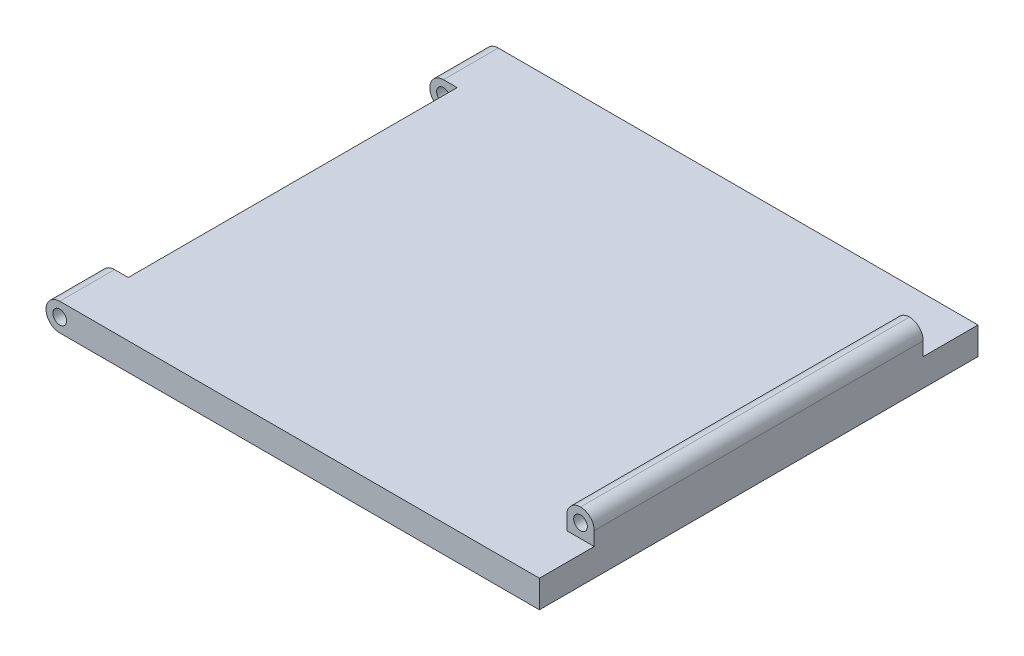
ISO-10303-21;
HEADER;
FILE_DESCRIPTION(('STEP AP214'),'2;1');
FILE_NAME('part.step','',(''),(''),'','','');
FILE_SCHEMA(('AUTOMOTIVE_DESIGN { 1 0 10303 214 1 1 1 1 }'));
ENDSEC;
DATA;
#1=APPLICATION_CONTEXT('core data for automotive mechanical design processes');
#2=APPLICATION_PROTOCOL_DEFINITION('international standard','automotive_design',2000,#1);
#3=PRODUCT_CONTEXT('',#1,'mechanical');
#4=PRODUCT('Part','Part','',(#3));
#5=PRODUCT_RELATED_PRODUCT_CATEGORY('part','',(#4));
#6=PRODUCT_DEFINITION_FORMATION('','',#4);
#7=PRODUCT_DEFINITION_CONTEXT('part definition',#1,'design');
#8=PRODUCT_DEFINITION('design','',#6,#7);
#9=PRODUCT_DEFINITION_SHAPE('','',#8);
#10=(LENGTH_UNIT() NAMED_UNIT(*) SI_UNIT(.MILLI.,.METRE.));
#11=(NAMED_UNIT(*) PLANE_ANGLE_UNIT() SI_UNIT($,.RADIAN.));
#12=(NAMED_UNIT(*) SI_UNIT($,.STERADIAN.) SOLID_ANGLE_UNIT());
#13=UNCERTAINTY_MEASURE_WITH_UNIT(LENGTH_MEASURE(1.E-05),#10,'distance_accuracy_value','');
#14=(GEOMETRIC_REPRESENTATION_CONTEXT(3) GLOBAL_UNCERTAINTY_ASSIGNED_CONTEXT((#13)) GLOBAL_UNIT_ASSIGNED_CONTEXT((#10,
#11,#12)) REPRESENTATION_CONTEXT('',''));
#15=CARTESIAN_POINT('',(0.,0.,0.));
#16=DIRECTION('',(0.,0.,1.));
#17=DIRECTION('',(1.,0.,0.));
#18=AXIS2_PLACEMENT_3D('',#15,#16,#17);
#19=CARTESIAN_POINT('',(85.,0.,40.));
#20=DIRECTION('',(-1.,0.,0.));
#21=DIRECTION('',(0.,0.,1.));
#22=AXIS2_PLACEMENT_3D('',#19,#20,#21);
#23=PLANE('',#22);
#24=DIRECTION('',(0.,1.,0.));
#25=VECTOR('',#24,1.);
#26=CARTESIAN_POINT('',(85.,10.,-30.));
#27=LINE('',#26,#25);
#28=CARTESIAN_POINT('',(85.,5.,-30.));
#29=VERTEX_POINT('',#28);
#30=CARTESIAN_POINT('',(85.,7.5,-30.));
#31=VERTEX_POINT('',#30);
#32=EDGE_CURVE('E240',#29,#31,#27,.T.);
#33=ORIENTED_EDGE('',*,*,#32,.T.);
#34=DIRECTION('',(0.,0.,-1.));
#35=VECTOR('',#34,1.);
#36=CARTESIAN_POINT('',(85.,7.5,40.));
#37=LINE('',#36,#35);
#38=CARTESIAN_POINT('',(85.,7.5,30.));
#39=VERTEX_POINT('',#38);
#40=EDGE_CURVE('E11',#31,#39,#37,.F.);
#41=ORIENTED_EDGE('',*,*,#40,.T.);
#42=DIRECTION('',(0.,1.,0.));
#43=VECTOR('',#42,1.);
#44=CARTESIAN_POINT('',(85.,10.,30.));
#45=LINE('',#44,#43);
#46=CARTESIAN_POINT('',(85.,5.,30.));
#47=VERTEX_POINT('',#46);
#48=EDGE_CURVE('E152',#47,#39,#45,.T.);
#49=ORIENTED_EDGE('',*,*,#48,.F.);
#50=DIRECTION('',(0.,0.,-1.));
#51=VECTOR('',#50,1.);
#52=CARTESIAN_POINT('',(85.,5.,40.));
#53=LINE('',#52,#51);
#54=CARTESIAN_POINT('',(85.,5.,40.));
#55=VERTEX_POINT('',#54);
#56=EDGE_CURVE('E139',#55,#47,#53,.T.);
#57=ORIENTED_EDGE('',*,*,#56,.F.);
#58=DIRECTION('',(0.,1.,0.));
#59=VECTOR('',#58,1.);
#60=CARTESIAN_POINT('',(85.,0.,40.));
#61=LINE('',#60,#59);
#62=CARTESIAN_POINT('',(85.,0.,40.));
#63=VERTEX_POINT('',#62);
#64=EDGE_CURVE('E148',#63,#55,#61,.T.);
#65=ORIENTED_EDGE('',*,*,#64,.F.);
#66=DIRECTION('',(0.,0.,-1.));
#67=VECTOR('',#66,1.);
#68=CARTESIAN_POINT('',(85.,0.,40.));
#69=LINE('',#68,#67);
#70=CARTESIAN_POINT('',(85.,0.,-40.));
#71=VERTEX_POINT('',#70);
#72=EDGE_CURVE('E182',#63,#71,#69,.T.);
#73=ORIENTED_EDGE('',*,*,#72,.T.);
#74=DIRECTION('',(0.,1.,0.));
#75=VECTOR('',#74,1.);
#76=CARTESIAN_POINT('',(85.,0.,-40.));
#77=LINE('',#76,#75);
#78=CARTESIAN_POINT('',(85.,5.,-40.));
#79=VERTEX_POINT('',#78);
#80=EDGE_CURVE('E170',#71,#79,#77,.T.);
#81=ORIENTED_EDGE('',*,*,#80,.T.);
#82=DIRECTION('',(0.,0.,1.));
#83=VECTOR('',#82,1.);
#84=CARTESIAN_POINT('',(85.,5.,-40.));
#85=LINE('',#84,#83);
#86=EDGE_CURVE('E243',#79,#29,#85,.T.);
#87=ORIENTED_EDGE('',*,*,#86,.T.);
#88=EDGE_LOOP('',(#33,#41,#49,#57,#65,#73,#81,#87));
#89=FACE_BOUND('',#88,.T.);
#90=ADVANCED_FACE('F38',(#89),#23,.F.);
#91=CARTESIAN_POINT('',(0.,0.,40.));
#92=DIRECTION('',(0.,0.,1.));
#93=DIRECTION('',(1.,0.,0.));
#94=AXIS2_PLACEMENT_3D('',#91,#92,#93);
#95=PLANE('',#94);
#96=CARTESIAN_POINT('',(-2.5,2.5,40.));
#97=DIRECTION('',(0.,0.,1.));
#98=DIRECTION('',(1.,0.,0.));
#99=AXIS2_PLACEMENT_3D('',#96,#97,#98);
#100=CIRCLE('',#99,1.25);
#101=CARTESIAN_POINT('',(-1.25,2.5,40.));
#102=VERTEX_POINT('',#101);
#103=EDGE_CURVE('E285',#102,#102,#100,.T.);
#104=ORIENTED_EDGE('',*,*,#103,.F.);
#105=EDGE_LOOP('',(#104));
#106=FACE_BOUND('',#105,.T.);
#107=ORIENTED_EDGE('',*,*,#64,.T.);
#108=DIRECTION('',(-1.,0.,0.));
#109=VECTOR('',#108,1.);
#110=CARTESIAN_POINT('',(80.,5.00000000000001,40.));
#111=LINE('',#110,#109);
#112=CARTESIAN_POINT('',(-2.5,5.,40.));
#113=VERTEX_POINT('',#112);
#114=EDGE_CURVE('E135',#55,#113,#111,.T.);
#115=ORIENTED_EDGE('',*,*,#114,.T.);
#116=CARTESIAN_POINT('',(-2.5,2.5,40.));
#117=DIRECTION('',(0.,0.,1.));
#118=DIRECTION('',(1.,0.,0.));
#119=AXIS2_PLACEMENT_3D('',#116,#117,#118);
#120=CIRCLE('',#119,2.5);
#121=CARTESIAN_POINT('',(-2.5,0.,40.));
#122=VERTEX_POINT('',#121);
#123=EDGE_CURVE('E302',#113,#122,#120,.T.);
#124=ORIENTED_EDGE('',*,*,#123,.T.);
#125=DIRECTION('',(1.,0.,0.));
#126=VECTOR('',#125,1.);
#127=CARTESIAN_POINT('',(0.,0.,40.));
#128=LINE('',#127,#126);
#129=EDGE_CURVE('E158',#122,#63,#128,.T.);
#130=ORIENTED_EDGE('',*,*,#129,.T.);
#131=EDGE_LOOP('',(#107,#115,#124,#130));
#132=FACE_BOUND('',#131,.T.);
#133=ADVANCED_FACE('F157',(#106,#132),#95,.T.);
#134=CARTESIAN_POINT('',(0.,5.,40.));
#135=DIRECTION('',(1.,0.,0.));
#136=DIRECTION('',(0.,1.,0.));
#137=AXIS2_PLACEMENT_3D('',#134,#135,#136);
#138=PLANE('',#137);
#139=DIRECTION('',(0.,1.,0.));
#140=VECTOR('',#139,1.);
#141=CARTESIAN_POINT('',(0.,0.,-30.));
#142=LINE('',#141,#140);
#143=CARTESIAN_POINT('',(0.,0.,-30.));
#144=VERTEX_POINT('',#143);
#145=CARTESIAN_POINT('',(0.,5.,-30.));
#146=VERTEX_POINT('',#145);
#147=EDGE_CURVE('E255',#144,#146,#142,.T.);
#148=ORIENTED_EDGE('',*,*,#147,.F.);
#149=DIRECTION('',(0.,0.,-1.));
#150=VECTOR('',#149,1.);
#151=CARTESIAN_POINT('',(0.,0.,40.));
#152=LINE('',#151,#150);
#153=CARTESIAN_POINT('',(0.,0.,30.));
#154=VERTEX_POINT('',#153);
#155=EDGE_CURVE('E185',#154,#144,#152,.T.);
#156=ORIENTED_EDGE('',*,*,#155,.F.);
#157=DIRECTION('',(0.,1.,0.));
#158=VECTOR('',#157,1.);
#159=CARTESIAN_POINT('',(0.,0.,30.));
#160=LINE('',#159,#158);
#161=CARTESIAN_POINT('',(0.,5.,30.));
#162=VERTEX_POINT('',#161);
#163=EDGE_CURVE('E289',#154,#162,#160,.T.);
#164=ORIENTED_EDGE('',*,*,#163,.T.);
#165=DIRECTION('',(0.,0.,-1.));
#166=VECTOR('',#165,1.);
#167=CARTESIAN_POINT('',(0.,5.,40.));
#168=LINE('',#167,#166);
#169=EDGE_CURVE('E147',#162,#146,#168,.T.);
#170=ORIENTED_EDGE('',*,*,#169,.T.);
#171=EDGE_LOOP('',(#148,#156,#164,#170));
#172=FACE_BOUND('',#171,.T.);
#173=ADVANCED_FACE('F339',(#172),#138,.F.);
#174=CARTESIAN_POINT('',(0.,0.,40.));
#175=DIRECTION('',(0.,1.,0.));
#176=DIRECTION('',(0.,0.,1.));
#177=AXIS2_PLACEMENT_3D('',#174,#175,#176);
#178=PLANE('',#177);
#179=DIRECTION('',(1.,0.,0.));
#180=VECTOR('',#179,1.);
#181=CARTESIAN_POINT('',(0.,0.,-40.));
#182=LINE('',#181,#180);
#183=CARTESIAN_POINT('',(-2.5,0.,-40.));
#184=VERTEX_POINT('',#183);
#185=EDGE_CURVE('E167',#184,#71,#182,.T.);
#186=ORIENTED_EDGE('',*,*,#185,.T.);
#187=ORIENTED_EDGE('',*,*,#72,.F.);
#188=ORIENTED_EDGE('',*,*,#129,.F.);
#189=DIRECTION('',(0.,0.,-1.));
#190=VECTOR('',#189,1.);
#191=CARTESIAN_POINT('',(-2.5,0.,40.));
#192=LINE('',#191,#190);
#193=CARTESIAN_POINT('',(-2.5,0.,30.));
#194=VERTEX_POINT('',#193);
#195=EDGE_CURVE('E305',#122,#194,#192,.T.);
#196=ORIENTED_EDGE('',*,*,#195,.T.);
#197=DIRECTION('',(1.,0.,0.));
#198=VECTOR('',#197,1.);
#199=CARTESIAN_POINT('',(-2.5,0.,30.));
#200=LINE('',#199,#198);
#201=EDGE_CURVE('E299',#194,#154,#200,.T.);
#202=ORIENTED_EDGE('',*,*,#201,.T.);
#203=ORIENTED_EDGE('',*,*,#155,.T.);
#204=DIRECTION('',(1.,0.,0.));
#205=VECTOR('',#204,1.);
#206=CARTESIAN_POINT('',(-2.5,0.,-30.));
#207=LINE('',#206,#205);
#208=CARTESIAN_POINT('',(-2.5,0.,-30.));
#209=VERTEX_POINT('',#208);
#210=EDGE_CURVE('E259',#209,#144,#207,.T.);
#211=ORIENTED_EDGE('',*,*,#210,.F.);
#212=DIRECTION('',(0.,0.,1.));
#213=VECTOR('',#212,1.);
#214=CARTESIAN_POINT('',(-2.5,0.,-40.));
#215=LINE('',#214,#213);
#216=EDGE_CURVE('E278',#184,#209,#215,.T.);
#217=ORIENTED_EDGE('',*,*,#216,.F.);
#218=EDGE_LOOP('',(#186,#187,#188,#196,#202,#203,#211,#217));
#219=FACE_BOUND('',#218,.T.);
#220=ADVANCED_FACE('F321',(#219),#178,.F.);
#221=CARTESIAN_POINT('',(80.,10.,40.));
#222=DIRECTION('',(1.,0.,0.));
#223=DIRECTION('',(0.,0.,-1.));
#224=AXIS2_PLACEMENT_3D('',#221,#222,#223);
#225=PLANE('',#224);
#226=DIRECTION('',(0.,-1.,0.));
#227=VECTOR('',#226,1.);
#228=CARTESIAN_POINT('',(80.,10.,30.));
#229=LINE('',#228,#227);
#230=CARTESIAN_POINT('',(80.,7.5,30.));
#231=VERTEX_POINT('',#230);
#232=CARTESIAN_POINT('',(80.,5.,30.));
#233=VERTEX_POINT('',#232);
#234=EDGE_CURVE('E210',#231,#233,#229,.T.);
#235=ORIENTED_EDGE('',*,*,#234,.F.);
#236=DIRECTION('',(0.,0.,-1.));
#237=VECTOR('',#236,1.);
#238=CARTESIAN_POINT('',(80.,7.5,40.));
#239=LINE('',#238,#237);
#240=CARTESIAN_POINT('',(80.,7.5,-30.));
#241=VERTEX_POINT('',#240);
#242=EDGE_CURVE('E189',#231,#241,#239,.T.);
#243=ORIENTED_EDGE('',*,*,#242,.T.);
#244=DIRECTION('',(0.,-1.,0.));
#245=VECTOR('',#244,1.);
#246=CARTESIAN_POINT('',(80.,10.,-30.));
#247=LINE('',#246,#245);
#248=CARTESIAN_POINT('',(80.,5.,-30.));
#249=VERTEX_POINT('',#248);
#250=EDGE_CURVE('E154',#241,#249,#247,.T.);
#251=ORIENTED_EDGE('',*,*,#250,.T.);
#252=DIRECTION('',(0.,0.,-1.));
#253=VECTOR('',#252,1.);
#254=CARTESIAN_POINT('',(80.,5.00000000000001,40.));
#255=LINE('',#254,#253);
#256=EDGE_CURVE('E178',#233,#249,#255,.T.);
#257=ORIENTED_EDGE('',*,*,#256,.F.);
#258=EDGE_LOOP('',(#235,#243,#251,#257));
#259=FACE_BOUND('',#258,.T.);
#260=ADVANCED_FACE('F216',(#259),#225,.F.);
#261=CARTESIAN_POINT('',(80.,5.00000000000001,40.));
#262=DIRECTION('',(0.,-1.,0.));
#263=DIRECTION('',(1.,0.,0.));
#264=AXIS2_PLACEMENT_3D('',#261,#262,#263);
#265=PLANE('',#264);
#266=DIRECTION('',(-1.,0.,0.));
#267=VECTOR('',#266,1.);
#268=CARTESIAN_POINT('',(80.,5.00000000000001,-40.));
#269=LINE('',#268,#267);
#270=CARTESIAN_POINT('',(-2.5,5.,-40.));
#271=VERTEX_POINT('',#270);
#272=EDGE_CURVE('E163',#79,#271,#269,.T.);
#273=ORIENTED_EDGE('',*,*,#272,.T.);
#274=DIRECTION('',(0.,0.,1.));
#275=VECTOR('',#274,1.);
#276=CARTESIAN_POINT('',(-2.5,5.,-40.));
#277=LINE('',#276,#275);
#278=CARTESIAN_POINT('',(-2.5,5.,-30.));
#279=VERTEX_POINT('',#278);
#280=EDGE_CURVE('E275',#271,#279,#277,.T.);
#281=ORIENTED_EDGE('',*,*,#280,.T.);
#282=DIRECTION('',(-1.,0.,0.));
#283=VECTOR('',#282,1.);
#284=CARTESIAN_POINT('',(0.,5.,-30.));
#285=LINE('',#284,#283);
#286=EDGE_CURVE('E267',#146,#279,#285,.T.);
#287=ORIENTED_EDGE('',*,*,#286,.F.);
#288=ORIENTED_EDGE('',*,*,#169,.F.);
#289=DIRECTION('',(-1.,0.,0.));
#290=VECTOR('',#289,1.);
#291=CARTESIAN_POINT('',(0.,5.,30.));
#292=LINE('',#291,#290);
#293=CARTESIAN_POINT('',(-2.5,5.,30.));
#294=VERTEX_POINT('',#293);
#295=EDGE_CURVE('E293',#162,#294,#292,.T.);
#296=ORIENTED_EDGE('',*,*,#295,.T.);
#297=DIRECTION('',(0.,0.,-1.));
#298=VECTOR('',#297,1.);
#299=CARTESIAN_POINT('',(-2.5,5.,40.));
#300=LINE('',#299,#298);
#301=EDGE_CURVE('E141',#113,#294,#300,.T.);
#302=ORIENTED_EDGE('',*,*,#301,.F.);
#303=ORIENTED_EDGE('',*,*,#114,.F.);
#304=ORIENTED_EDGE('',*,*,#56,.T.);
#305=DIRECTION('',(1.,0.,0.));
#306=VECTOR('',#305,1.);
#307=CARTESIAN_POINT('',(80.,5.,30.));
#308=LINE('',#307,#306);
#309=EDGE_CURVE('E155',#233,#47,#308,.T.);
#310=ORIENTED_EDGE('',*,*,#309,.F.);
#311=ORIENTED_EDGE('',*,*,#256,.T.);
#312=DIRECTION('',(1.,0.,0.));
#313=VECTOR('',#312,1.);
#314=CARTESIAN_POINT('',(80.,5.,-30.));
#315=LINE('',#314,#313);
#316=EDGE_CURVE('E236',#249,#29,#315,.T.);
#317=ORIENTED_EDGE('',*,*,#316,.T.);
#318=ORIENTED_EDGE('',*,*,#86,.F.);
#319=EDGE_LOOP('',(#273,#281,#287,#288,#296,#302,#303,#304,#310,#311,#317,#318));
#320=FACE_BOUND('',#319,.T.);
#321=ADVANCED_FACE('F137',(#320),#265,.F.);
#322=CARTESIAN_POINT('',(0.,0.,-40.));
#323=DIRECTION('',(0.,0.,1.));
#324=DIRECTION('',(1.,0.,0.));
#325=AXIS2_PLACEMENT_3D('',#322,#323,#324);
#326=PLANE('',#325);
#327=ORIENTED_EDGE('',*,*,#272,.F.);
#328=ORIENTED_EDGE('',*,*,#80,.F.);
#329=ORIENTED_EDGE('',*,*,#185,.F.);
#330=CARTESIAN_POINT('',(-2.5,2.5,-40.));
#331=DIRECTION('',(0.,0.,1.));
#332=DIRECTION('',(1.,0.,0.));
#333=AXIS2_PLACEMENT_3D('',#330,#331,#332);
#334=CIRCLE('',#333,2.5);
#335=EDGE_CURVE('E271',#271,#184,#334,.T.);
#336=ORIENTED_EDGE('',*,*,#335,.F.);
#337=EDGE_LOOP('',(#327,#328,#329,#336));
#338=FACE_BOUND('',#337,.T.);
#339=CARTESIAN_POINT('',(-2.5,2.5,-40.));
#340=DIRECTION('',(0.,0.,1.));
#341=DIRECTION('',(1.,0.,0.));
#342=AXIS2_PLACEMENT_3D('',#339,#340,#341);
#343=CIRCLE('',#342,1.25);
#344=CARTESIAN_POINT('',(-1.25,2.5,-40.));
#345=VERTEX_POINT('',#344);
#346=EDGE_CURVE('E251',#345,#345,#343,.T.);
#347=ORIENTED_EDGE('',*,*,#346,.T.);
#348=EDGE_LOOP('',(#347));
#349=FACE_BOUND('',#348,.T.);
#350=ADVANCED_FACE('F326',(#338,#349),#326,.F.);
#351=CARTESIAN_POINT('',(-2.5,2.5,30.));
#352=DIRECTION('',(0.,0.,1.));
#353=DIRECTION('',(1.,0.,0.));
#354=AXIS2_PLACEMENT_3D('',#351,#352,#353);
#355=PLANE('',#354);
#356=ORIENTED_EDGE('',*,*,#163,.F.);
#357=ORIENTED_EDGE('',*,*,#201,.F.);
#358=CARTESIAN_POINT('',(-2.5,2.5,30.));
#359=DIRECTION('',(0.,0.,1.));
#360=DIRECTION('',(1.,0.,0.));
#361=AXIS2_PLACEMENT_3D('',#358,#359,#360);
#362=CIRCLE('',#361,2.5);
#363=EDGE_CURVE('E296',#294,#194,#362,.T.);
#364=ORIENTED_EDGE('',*,*,#363,.F.);
#365=ORIENTED_EDGE('',*,*,#295,.F.);
#366=EDGE_LOOP('',(#356,#357,#364,#365));
#367=FACE_BOUND('',#366,.T.);
#368=CARTESIAN_POINT('',(-2.5,2.5,30.));
#369=DIRECTION('',(0.,0.,1.));
#370=DIRECTION('',(1.,0.,0.));
#371=AXIS2_PLACEMENT_3D('',#368,#369,#370);
#372=CIRCLE('',#371,1.25);
#373=CARTESIAN_POINT('',(-1.25,2.5,30.));
#374=VERTEX_POINT('',#373);
#375=EDGE_CURVE('E281',#374,#374,#372,.T.);
#376=ORIENTED_EDGE('',*,*,#375,.T.);
#377=EDGE_LOOP('',(#376));
#378=FACE_BOUND('',#377,.T.);
#379=ADVANCED_FACE('F317',(#367,#378),#355,.F.);
#380=CARTESIAN_POINT('',(-2.5,2.5,40.));
#381=DIRECTION('',(0.,0.,-1.));
#382=DIRECTION('',(-1.,0.,0.));
#383=AXIS2_PLACEMENT_3D('',#380,#381,#382);
#384=CYLINDRICAL_SURFACE('',#383,2.5);
#385=ORIENTED_EDGE('',*,*,#363,.T.);
#386=ORIENTED_EDGE('',*,*,#195,.F.);
#387=ORIENTED_EDGE('',*,*,#123,.F.);
#388=ORIENTED_EDGE('',*,*,#301,.T.);
#389=EDGE_LOOP('',(#385,#386,#387,#388));
#390=FACE_BOUND('',#389,.T.);
#391=ADVANCED_FACE('F312',(#390),#384,.T.);
#392=CARTESIAN_POINT('',(-2.5,2.5,40.));
#393=DIRECTION('',(0.,0.,-1.));
#394=DIRECTION('',(-1.,0.,0.));
#395=AXIS2_PLACEMENT_3D('',#392,#393,#394);
#396=CYLINDRICAL_SURFACE('',#395,1.25);
#397=ORIENTED_EDGE('',*,*,#103,.T.);
#398=EDGE_LOOP('',(#397));
#399=FACE_BOUND('',#398,.T.);
#400=ORIENTED_EDGE('',*,*,#375,.F.);
#401=EDGE_LOOP('',(#400));
#402=FACE_BOUND('',#401,.T.);
#403=ADVANCED_FACE('F363',(#399,#402),#396,.F.);
#404=CARTESIAN_POINT('',(-2.5,2.5,-40.));
#405=DIRECTION('',(0.,0.,1.));
#406=DIRECTION('',(1.,0.,0.));
#407=AXIS2_PLACEMENT_3D('',#404,#405,#406);
#408=CYLINDRICAL_SURFACE('',#407,2.5);
#409=CARTESIAN_POINT('',(-2.5,2.5,-30.));
#410=DIRECTION('',(0.,0.,1.));
#411=DIRECTION('',(1.,0.,0.));
#412=AXIS2_PLACEMENT_3D('',#409,#410,#411);
#413=CIRCLE('',#412,2.5);
#414=EDGE_CURVE('E263',#279,#209,#413,.T.);
#415=ORIENTED_EDGE('',*,*,#414,.F.);
#416=ORIENTED_EDGE('',*,*,#280,.F.);
#417=ORIENTED_EDGE('',*,*,#335,.T.);
#418=ORIENTED_EDGE('',*,*,#216,.T.);
#419=EDGE_LOOP('',(#415,#416,#417,#418));
#420=FACE_BOUND('',#419,.T.);
#421=ADVANCED_FACE('F334',(#420),#408,.T.);
#422=CARTESIAN_POINT('',(-2.5,2.5,-30.));
#423=DIRECTION('',(0.,0.,-1.));
#424=DIRECTION('',(1.,0.,0.));
#425=AXIS2_PLACEMENT_3D('',#422,#423,#424);
#426=PLANE('',#425);
#427=CARTESIAN_POINT('',(-2.5,2.5,-30.));
#428=DIRECTION('',(0.,0.,1.));
#429=DIRECTION('',(1.,0.,0.));
#430=AXIS2_PLACEMENT_3D('',#427,#428,#429);
#431=CIRCLE('',#430,1.25);
#432=CARTESIAN_POINT('',(-1.25,2.5,-30.));
#433=VERTEX_POINT('',#432);
#434=EDGE_CURVE('E247',#433,#433,#431,.T.);
#435=ORIENTED_EDGE('',*,*,#434,.F.);
#436=EDGE_LOOP('',(#435));
#437=FACE_BOUND('',#436,.T.);
#438=ORIENTED_EDGE('',*,*,#147,.T.);
#439=ORIENTED_EDGE('',*,*,#286,.T.);
#440=ORIENTED_EDGE('',*,*,#414,.T.);
#441=ORIENTED_EDGE('',*,*,#210,.T.);
#442=EDGE_LOOP('',(#438,#439,#440,#441));
#443=FACE_BOUND('',#442,.T.);
#444=ADVANCED_FACE('F336',(#437,#443),#426,.F.);
#445=CARTESIAN_POINT('',(-2.5,2.5,-40.));
#446=DIRECTION('',(0.,0.,1.));
#447=DIRECTION('',(1.,0.,0.));
#448=AXIS2_PLACEMENT_3D('',#445,#446,#447);
#449=CYLINDRICAL_SURFACE('',#448,1.25);
#450=ORIENTED_EDGE('',*,*,#346,.F.);
#451=EDGE_LOOP('',(#450));
#452=FACE_BOUND('',#451,.T.);
#453=ORIENTED_EDGE('',*,*,#434,.T.);
#454=EDGE_LOOP('',(#453));
#455=FACE_BOUND('',#454,.T.);
#456=ADVANCED_FACE('F373',(#452,#455),#449,.F.);
#457=CARTESIAN_POINT('',(0.,0.,-30.));
#458=DIRECTION('',(0.,0.,1.));
#459=DIRECTION('',(1.,0.,0.));
#460=AXIS2_PLACEMENT_3D('',#457,#458,#459);
#461=PLANE('',#460);
#462=CARTESIAN_POINT('',(82.5,7.5,-30.));
#463=DIRECTION('',(0.,0.,1.));
#464=DIRECTION('',(1.,0.,0.));
#465=AXIS2_PLACEMENT_3D('',#462,#463,#464);
#466=CIRCLE('',#465,1.25);
#467=CARTESIAN_POINT('',(83.75,7.5,-30.));
#468=VERTEX_POINT('',#467);
#469=EDGE_CURVE('E194',#468,#468,#466,.T.);
#470=ORIENTED_EDGE('',*,*,#469,.T.);
#471=EDGE_LOOP('',(#470));
#472=FACE_BOUND('',#471,.T.);
#473=ORIENTED_EDGE('',*,*,#250,.F.);
#474=CARTESIAN_POINT('',(82.5,7.5,-30.));
#475=DIRECTION('',(0.,0.,1.));
#476=DIRECTION('',(1.,0.,0.));
#477=AXIS2_PLACEMENT_3D('',#474,#475,#476);
#478=CIRCLE('',#477,2.5);
#479=CARTESIAN_POINT('',(82.5,10.,-30.));
#480=VERTEX_POINT('',#479);
#481=EDGE_CURVE('E201',#241,#480,#478,.F.);
#482=ORIENTED_EDGE('',*,*,#481,.T.);
#483=CARTESIAN_POINT('',(82.5,7.5,-30.));
#484=DIRECTION('',(0.,0.,1.));
#485=DIRECTION('',(1.,0.,0.));
#486=AXIS2_PLACEMENT_3D('',#483,#484,#485);
#487=CIRCLE('',#486,2.5);
#488=EDGE_CURVE('E198',#480,#31,#487,.F.);
#489=ORIENTED_EDGE('',*,*,#488,.T.);
#490=ORIENTED_EDGE('',*,*,#32,.F.);
#491=ORIENTED_EDGE('',*,*,#316,.F.);
#492=EDGE_LOOP('',(#473,#482,#489,#490,#491));
#493=FACE_BOUND('',#492,.T.);
#494=ADVANCED_FACE('F223',(#472,#493),#461,.F.);
#495=CARTESIAN_POINT('',(0.,0.,30.));
#496=DIRECTION('',(0.,0.,-1.));
#497=DIRECTION('',(1.,0.,0.));
#498=AXIS2_PLACEMENT_3D('',#495,#496,#497);
#499=PLANE('',#498);
#500=CARTESIAN_POINT('',(82.5,7.5,30.));
#501=DIRECTION('',(0.,0.,-1.));
#502=DIRECTION('',(-1.,0.,0.));
#503=AXIS2_PLACEMENT_3D('',#500,#501,#502);
#504=CIRCLE('',#503,1.25);
#505=CARTESIAN_POINT('',(81.25,7.5,30.));
#506=VERTEX_POINT('',#505);
#507=EDGE_CURVE('E190',#506,#506,#504,.T.);
#508=ORIENTED_EDGE('',*,*,#507,.T.);
#509=EDGE_LOOP('',(#508));
#510=FACE_BOUND('',#509,.T.);
#511=CARTESIAN_POINT('',(82.5,7.5,30.));
#512=DIRECTION('',(0.,0.,-1.));
#513=DIRECTION('',(-1.,0.,0.));
#514=AXIS2_PLACEMENT_3D('',#511,#512,#513);
#515=CIRCLE('',#514,2.5);
#516=CARTESIAN_POINT('',(82.5,10.,30.));
#517=VERTEX_POINT('',#516);
#518=EDGE_CURVE('E55',#39,#517,#515,.F.);
#519=ORIENTED_EDGE('',*,*,#518,.T.);
#520=CARTESIAN_POINT('',(82.5,7.5,30.));
#521=DIRECTION('',(0.,0.,-1.));
#522=DIRECTION('',(-1.,0.,0.));
#523=AXIS2_PLACEMENT_3D('',#520,#521,#522);
#524=CIRCLE('',#523,2.5);
#525=EDGE_CURVE('E48',#517,#231,#524,.F.);
#526=ORIENTED_EDGE('',*,*,#525,.T.);
#527=ORIENTED_EDGE('',*,*,#234,.T.);
#528=ORIENTED_EDGE('',*,*,#309,.T.);
#529=ORIENTED_EDGE('',*,*,#48,.T.);
#530=EDGE_LOOP('',(#519,#526,#527,#528,#529));
#531=FACE_BOUND('',#530,.T.);
#532=ADVANCED_FACE('F209',(#510,#531),#499,.F.);
#533=CARTESIAN_POINT('',(82.5,7.5,-40.));
#534=DIRECTION('',(0.,0.,1.));
#535=DIRECTION('',(1.,0.,0.));
#536=AXIS2_PLACEMENT_3D('',#533,#534,#535);
#537=CYLINDRICAL_SURFACE('',#536,1.25);
#538=ORIENTED_EDGE('',*,*,#507,.F.);
#539=EDGE_LOOP('',(#538));
#540=FACE_BOUND('',#539,.T.);
#541=ORIENTED_EDGE('',*,*,#469,.F.);
#542=EDGE_LOOP('',(#541));
#543=FACE_BOUND('',#542,.T.);
#544=ADVANCED_FACE('F383',(#540,#543),#537,.F.);
#545=CARTESIAN_POINT('',(82.5,7.5,40.));
#546=DIRECTION('',(0.,0.,-1.));
#547=DIRECTION('',(-1.,0.,0.));
#548=AXIS2_PLACEMENT_3D('',#545,#546,#547);
#549=CYLINDRICAL_SURFACE('',#548,2.5);
#550=DIRECTION('',(0.,0.,-1.));
#551=VECTOR('',#550,1.);
#552=CARTESIAN_POINT('',(82.5,10.,40.));
#553=LINE('',#552,#551);
#554=EDGE_CURVE('E42',#517,#480,#553,.T.);
#555=ORIENTED_EDGE('',*,*,#554,.F.);
#556=ORIENTED_EDGE('',*,*,#518,.F.);
#557=ORIENTED_EDGE('',*,*,#40,.F.);
#558=ORIENTED_EDGE('',*,*,#488,.F.);
#559=EDGE_LOOP('',(#555,#556,#557,#558));
#560=FACE_BOUND('',#559,.T.);
#561=ADVANCED_FACE('F40',(#560),#549,.T.);
#562=CARTESIAN_POINT('',(82.5,7.5,40.));
#563=DIRECTION('',(0.,0.,-1.));
#564=DIRECTION('',(-1.,0.,0.));
#565=AXIS2_PLACEMENT_3D('',#562,#563,#564);
#566=CYLINDRICAL_SURFACE('',#565,2.5);
#567=ORIENTED_EDGE('',*,*,#525,.F.);
#568=ORIENTED_EDGE('',*,*,#554,.T.);
#569=ORIENTED_EDGE('',*,*,#481,.F.);
#570=ORIENTED_EDGE('',*,*,#242,.F.);
#571=EDGE_LOOP('',(#567,#568,#569,#570));
#572=FACE_BOUND('',#571,.T.);
#573=ADVANCED_FACE('F220',(#572),#566,.T.);
#574=CLOSED_SHELL('',(#90,#133,#173,#220,#260,#321,#350,#379,#391,#403,#421,#444,#456,#494,#532,
#544,#561,#573));
#575=MANIFOLD_SOLID_BREP('B2',#574);
#576=ADVANCED_BREP_SHAPE_REPRESENTATION('',(#18,#575),#14);
#577=SHAPE_DEFINITION_REPRESENTATION(#9,#576);
ENDSEC;
END-ISO-10303-21;
